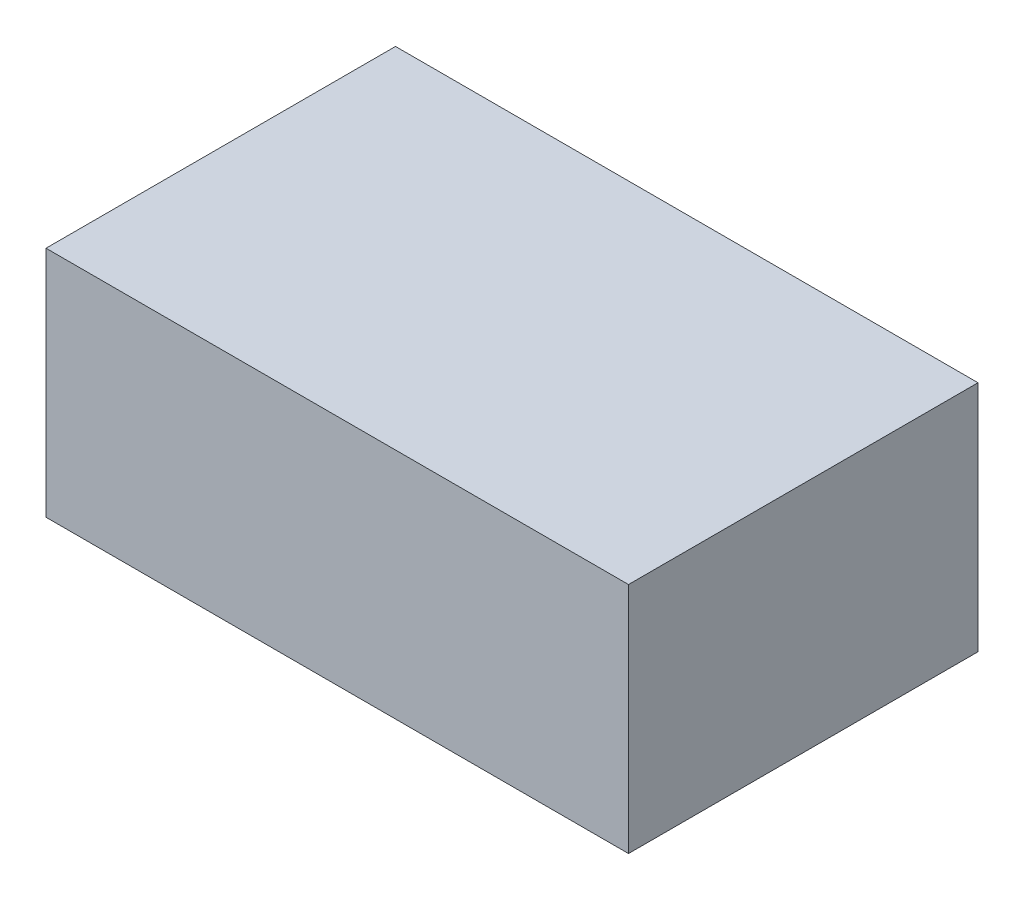
ISO-10303-21;
HEADER;
FILE_DESCRIPTION(('STEP AP214'),'2;1');
FILE_NAME('part.step','',(''),(''),'','','');
FILE_SCHEMA(('AUTOMOTIVE_DESIGN { 1 0 10303 214 1 1 1 1 }'));
ENDSEC;
DATA;
#1=APPLICATION_CONTEXT('core data for automotive mechanical design processes');
#2=APPLICATION_PROTOCOL_DEFINITION('international standard','automotive_design',2000,#1);
#3=PRODUCT_CONTEXT('',#1,'mechanical');
#4=PRODUCT('Part','Part','',(#3));
#5=PRODUCT_RELATED_PRODUCT_CATEGORY('part','',(#4));
#6=PRODUCT_DEFINITION_FORMATION('','',#4);
#7=PRODUCT_DEFINITION_CONTEXT('part definition',#1,'design');
#8=PRODUCT_DEFINITION('design','',#6,#7);
#9=PRODUCT_DEFINITION_SHAPE('','',#8);
#10=(LENGTH_UNIT() NAMED_UNIT(*) SI_UNIT(.MILLI.,.METRE.));
#11=(NAMED_UNIT(*) PLANE_ANGLE_UNIT() SI_UNIT($,.RADIAN.));
#12=(NAMED_UNIT(*) SI_UNIT($,.STERADIAN.) SOLID_ANGLE_UNIT());
#13=UNCERTAINTY_MEASURE_WITH_UNIT(LENGTH_MEASURE(1.E-05),#10,'distance_accuracy_value','');
#14=(GEOMETRIC_REPRESENTATION_CONTEXT(3) GLOBAL_UNCERTAINTY_ASSIGNED_CONTEXT((#13)) GLOBAL_UNIT_ASSIGNED_CONTEXT((#10,
#11,#12)) REPRESENTATION_CONTEXT('',''));
#15=CARTESIAN_POINT('',(0.,0.,0.));
#16=DIRECTION('',(0.,0.,1.));
#17=DIRECTION('',(1.,0.,0.));
#18=AXIS2_PLACEMENT_3D('',#15,#16,#17);
#19=CARTESIAN_POINT('',(-125.,100.,-75.));
#20=DIRECTION('',(1.,0.,0.));
#21=DIRECTION('',(0.,0.,-1.));
#22=AXIS2_PLACEMENT_3D('',#19,#20,#21);
#23=PLANE('',#22);
#24=DIRECTION('',(0.,0.,1.));
#25=VECTOR('',#24,1.);
#26=CARTESIAN_POINT('',(-125.,0.,-75.));
#27=LINE('',#26,#25);
#28=CARTESIAN_POINT('',(-125.,0.,-75.));
#29=VERTEX_POINT('',#28);
#30=CARTESIAN_POINT('',(-125.,0.,75.));
#31=VERTEX_POINT('',#30);
#32=EDGE_CURVE('E100',#29,#31,#27,.T.);
#33=ORIENTED_EDGE('',*,*,#32,.T.);
#34=DIRECTION('',(0.,-1.,0.));
#35=VECTOR('',#34,1.);
#36=CARTESIAN_POINT('',(-125.,100.,75.));
#37=LINE('',#36,#35);
#38=CARTESIAN_POINT('',(-125.,100.,75.));
#39=VERTEX_POINT('',#38);
#40=EDGE_CURVE('E11',#39,#31,#37,.T.);
#41=ORIENTED_EDGE('',*,*,#40,.F.);
#42=DIRECTION('',(0.,0.,1.));
#43=VECTOR('',#42,1.);
#44=CARTESIAN_POINT('',(-125.,100.,-75.));
#45=LINE('',#44,#43);
#46=CARTESIAN_POINT('',(-125.,100.,-75.));
#47=VERTEX_POINT('',#46);
#48=EDGE_CURVE('E88',#47,#39,#45,.T.);
#49=ORIENTED_EDGE('',*,*,#48,.F.);
#50=DIRECTION('',(0.,-1.,0.));
#51=VECTOR('',#50,1.);
#52=CARTESIAN_POINT('',(-125.,100.,-75.));
#53=LINE('',#52,#51);
#54=EDGE_CURVE('E96',#47,#29,#53,.T.);
#55=ORIENTED_EDGE('',*,*,#54,.T.);
#56=EDGE_LOOP('',(#33,#41,#49,#55));
#57=FACE_BOUND('',#56,.T.);
#58=ADVANCED_FACE('F37',(#57),#23,.F.);
#59=CARTESIAN_POINT('',(-125.,100.,75.));
#60=DIRECTION('',(0.,0.,-1.));
#61=DIRECTION('',(-1.,0.,0.));
#62=AXIS2_PLACEMENT_3D('',#59,#60,#61);
#63=PLANE('',#62);
#64=DIRECTION('',(1.,0.,0.));
#65=VECTOR('',#64,1.);
#66=CARTESIAN_POINT('',(-125.,0.,75.));
#67=LINE('',#66,#65);
#68=CARTESIAN_POINT('',(125.,0.,75.));
#69=VERTEX_POINT('',#68);
#70=EDGE_CURVE('E92',#31,#69,#67,.T.);
#71=ORIENTED_EDGE('',*,*,#70,.T.);
#72=DIRECTION('',(0.,-1.,0.));
#73=VECTOR('',#72,1.);
#74=CARTESIAN_POINT('',(125.,100.,75.));
#75=LINE('',#74,#73);
#76=CARTESIAN_POINT('',(125.,100.,75.));
#77=VERTEX_POINT('',#76);
#78=EDGE_CURVE('E45',#77,#69,#75,.T.);
#79=ORIENTED_EDGE('',*,*,#78,.F.);
#80=DIRECTION('',(1.,0.,0.));
#81=VECTOR('',#80,1.);
#82=CARTESIAN_POINT('',(-125.,100.,75.));
#83=LINE('',#82,#81);
#84=EDGE_CURVE('E83',#39,#77,#83,.T.);
#85=ORIENTED_EDGE('',*,*,#84,.F.);
#86=ORIENTED_EDGE('',*,*,#40,.T.);
#87=EDGE_LOOP('',(#71,#79,#85,#86));
#88=FACE_BOUND('',#87,.T.);
#89=ADVANCED_FACE('F91',(#88),#63,.F.);
#90=CARTESIAN_POINT('',(125.,100.,-75.));
#91=DIRECTION('',(-1.,0.,0.));
#92=DIRECTION('',(0.,0.,1.));
#93=AXIS2_PLACEMENT_3D('',#90,#91,#92);
#94=PLANE('',#93);
#95=DIRECTION('',(0.,0.,-1.));
#96=VECTOR('',#95,1.);
#97=CARTESIAN_POINT('',(125.,0.,-75.));
#98=LINE('',#97,#96);
#99=CARTESIAN_POINT('',(125.,0.,-75.));
#100=VERTEX_POINT('',#99);
#101=EDGE_CURVE('E70',#69,#100,#98,.T.);
#102=ORIENTED_EDGE('',*,*,#101,.T.);
#103=DIRECTION('',(0.,-1.,0.));
#104=VECTOR('',#103,1.);
#105=CARTESIAN_POINT('',(125.,100.,-75.));
#106=LINE('',#105,#104);
#107=CARTESIAN_POINT('',(125.,100.,-75.));
#108=VERTEX_POINT('',#107);
#109=EDGE_CURVE('E93',#108,#100,#106,.T.);
#110=ORIENTED_EDGE('',*,*,#109,.F.);
#111=DIRECTION('',(0.,0.,-1.));
#112=VECTOR('',#111,1.);
#113=CARTESIAN_POINT('',(125.,100.,-75.));
#114=LINE('',#113,#112);
#115=EDGE_CURVE('E86',#77,#108,#114,.T.);
#116=ORIENTED_EDGE('',*,*,#115,.F.);
#117=ORIENTED_EDGE('',*,*,#78,.T.);
#118=EDGE_LOOP('',(#102,#110,#116,#117));
#119=FACE_BOUND('',#118,.T.);
#120=ADVANCED_FACE('F94',(#119),#94,.F.);
#121=CARTESIAN_POINT('',(-125.,100.,-75.));
#122=DIRECTION('',(0.,0.,1.));
#123=DIRECTION('',(1.,0.,0.));
#124=AXIS2_PLACEMENT_3D('',#121,#122,#123);
#125=PLANE('',#124);
#126=DIRECTION('',(-1.,0.,0.));
#127=VECTOR('',#126,1.);
#128=CARTESIAN_POINT('',(-125.,0.,-75.));
#129=LINE('',#128,#127);
#130=EDGE_CURVE('E76',#100,#29,#129,.T.);
#131=ORIENTED_EDGE('',*,*,#130,.T.);
#132=ORIENTED_EDGE('',*,*,#54,.F.);
#133=DIRECTION('',(-1.,0.,0.));
#134=VECTOR('',#133,1.);
#135=CARTESIAN_POINT('',(-125.,100.,-75.));
#136=LINE('',#135,#134);
#137=EDGE_CURVE('E53',#108,#47,#136,.T.);
#138=ORIENTED_EDGE('',*,*,#137,.F.);
#139=ORIENTED_EDGE('',*,*,#109,.T.);
#140=EDGE_LOOP('',(#131,#132,#138,#139));
#141=FACE_BOUND('',#140,.T.);
#142=ADVANCED_FACE('F107',(#141),#125,.F.);
#143=CARTESIAN_POINT('',(0.,100.,0.));
#144=DIRECTION('',(0.,1.,0.));
#145=DIRECTION('',(0.,0.,1.));
#146=AXIS2_PLACEMENT_3D('',#143,#144,#145);
#147=PLANE('',#146);
#148=ORIENTED_EDGE('',*,*,#48,.T.);
#149=ORIENTED_EDGE('',*,*,#84,.T.);
#150=ORIENTED_EDGE('',*,*,#115,.T.);
#151=ORIENTED_EDGE('',*,*,#137,.T.);
#152=EDGE_LOOP('',(#148,#149,#150,#151));
#153=FACE_BOUND('',#152,.T.);
#154=ADVANCED_FACE('F84',(#153),#147,.T.);
#155=CARTESIAN_POINT('',(0.,0.,0.));
#156=DIRECTION('',(0.,1.,0.));
#157=DIRECTION('',(0.,0.,1.));
#158=AXIS2_PLACEMENT_3D('',#155,#156,#157);
#159=PLANE('',#158);
#160=ORIENTED_EDGE('',*,*,#32,.F.);
#161=ORIENTED_EDGE('',*,*,#130,.F.);
#162=ORIENTED_EDGE('',*,*,#101,.F.);
#163=ORIENTED_EDGE('',*,*,#70,.F.);
#164=EDGE_LOOP('',(#160,#161,#162,#163));
#165=FACE_BOUND('',#164,.T.);
#166=ADVANCED_FACE('F110',(#165),#159,.F.);
#167=CLOSED_SHELL('',(#58,#89,#120,#142,#154,#166));
#168=MANIFOLD_SOLID_BREP('B2',#167);
#169=ADVANCED_BREP_SHAPE_REPRESENTATION('',(#18,#168),#14);
#170=SHAPE_DEFINITION_REPRESENTATION(#9,#169);
ENDSEC;
END-ISO-10303-21;
